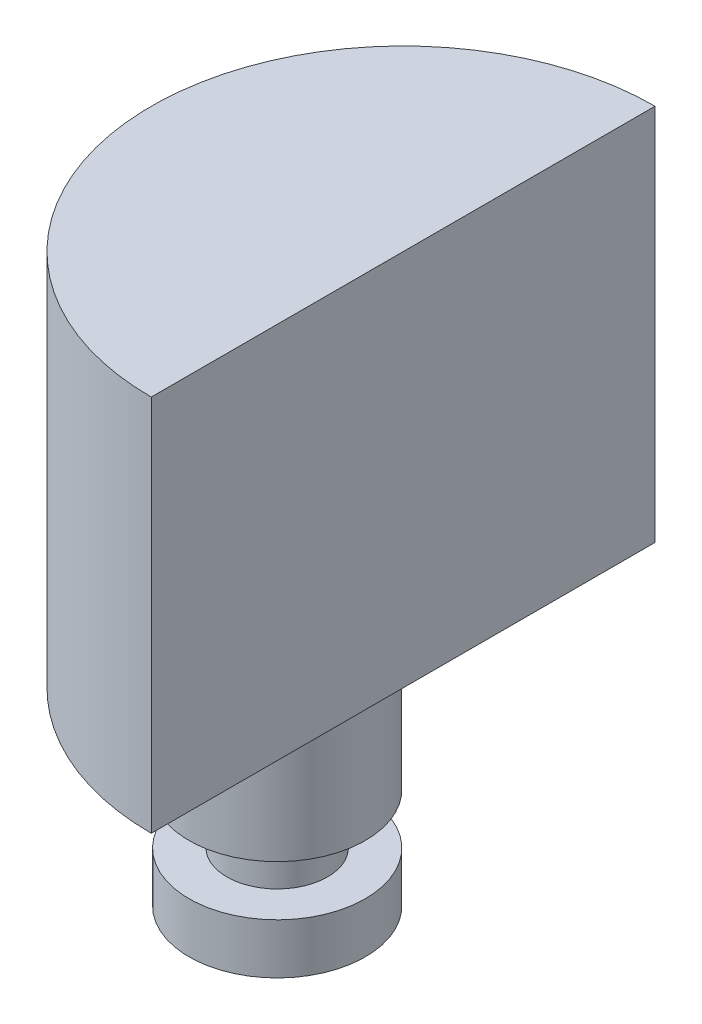
ISO-10303-21;
HEADER;
FILE_DESCRIPTION(('STEP AP214'),'2;1');
FILE_NAME('part.step','',(''),(''),'','','');
FILE_SCHEMA(('AUTOMOTIVE_DESIGN { 1 0 10303 214 1 1 1 1 }'));
ENDSEC;
DATA;
#1=APPLICATION_CONTEXT('core data for automotive mechanical design processes');
#2=APPLICATION_PROTOCOL_DEFINITION('international standard','automotive_design',2000,#1);
#3=PRODUCT_CONTEXT('',#1,'mechanical');
#4=PRODUCT('Part','Part','',(#3));
#5=PRODUCT_RELATED_PRODUCT_CATEGORY('part','',(#4));
#6=PRODUCT_DEFINITION_FORMATION('','',#4);
#7=PRODUCT_DEFINITION_CONTEXT('part definition',#1,'design');
#8=PRODUCT_DEFINITION('design','',#6,#7);
#9=PRODUCT_DEFINITION_SHAPE('','',#8);
#10=(LENGTH_UNIT() NAMED_UNIT(*) SI_UNIT(.MILLI.,.METRE.));
#11=(NAMED_UNIT(*) PLANE_ANGLE_UNIT() SI_UNIT($,.RADIAN.));
#12=(NAMED_UNIT(*) SI_UNIT($,.STERADIAN.) SOLID_ANGLE_UNIT());
#13=UNCERTAINTY_MEASURE_WITH_UNIT(LENGTH_MEASURE(1.E-05),#10,'distance_accuracy_value','');
#14=(GEOMETRIC_REPRESENTATION_CONTEXT(3) GLOBAL_UNCERTAINTY_ASSIGNED_CONTEXT((#13)) GLOBAL_UNIT_ASSIGNED_CONTEXT((#10,
#11,#12)) REPRESENTATION_CONTEXT('',''));
#15=CARTESIAN_POINT('',(0.,0.,0.));
#16=DIRECTION('',(0.,0.,1.));
#17=DIRECTION('',(1.,0.,0.));
#18=AXIS2_PLACEMENT_3D('',#15,#16,#17);
#19=CARTESIAN_POINT('',(0.,15.,0.));
#20=DIRECTION('',(0.,-1.,0.));
#21=DIRECTION('',(0.,0.,-1.));
#22=AXIS2_PLACEMENT_3D('',#19,#20,#21);
#23=CYLINDRICAL_SURFACE('',#22,10.);
#24=CARTESIAN_POINT('',(0.,0.,0.));
#25=DIRECTION('',(0.,1.,0.));
#26=DIRECTION('',(0.,0.,1.));
#27=AXIS2_PLACEMENT_3D('',#24,#25,#26);
#28=CIRCLE('',#27,10.);
#29=CARTESIAN_POINT('',(0.,0.,-10.));
#30=VERTEX_POINT('',#29);
#31=CARTESIAN_POINT('',(0.,0.,10.));
#32=VERTEX_POINT('',#31);
#33=EDGE_CURVE('E80',#30,#32,#28,.T.);
#34=ORIENTED_EDGE('',*,*,#33,.T.);
#35=DIRECTION('',(0.,-1.,0.));
#36=VECTOR('',#35,1.);
#37=CARTESIAN_POINT('',(0.,15.,10.));
#38=LINE('',#37,#36);
#39=CARTESIAN_POINT('',(0.,15.,10.));
#40=VERTEX_POINT('',#39);
#41=EDGE_CURVE('E46',#40,#32,#38,.T.);
#42=ORIENTED_EDGE('',*,*,#41,.F.);
#43=CARTESIAN_POINT('',(0.,15.,0.));
#44=DIRECTION('',(0.,1.,0.));
#45=DIRECTION('',(0.,0.,1.));
#46=AXIS2_PLACEMENT_3D('',#43,#44,#45);
#47=CIRCLE('',#46,10.);
#48=CARTESIAN_POINT('',(0.,15.,-10.));
#49=VERTEX_POINT('',#48);
#50=EDGE_CURVE('E79',#49,#40,#47,.T.);
#51=ORIENTED_EDGE('',*,*,#50,.F.);
#52=DIRECTION('',(0.,-1.,0.));
#53=VECTOR('',#52,1.);
#54=CARTESIAN_POINT('',(0.,15.,-10.));
#55=LINE('',#54,#53);
#56=EDGE_CURVE('E74',#49,#30,#55,.T.);
#57=ORIENTED_EDGE('',*,*,#56,.T.);
#58=EDGE_LOOP('',(#34,#42,#51,#57));
#59=FACE_BOUND('',#58,.T.);
#60=ADVANCED_FACE('F43',(#59),#23,.T.);
#61=CARTESIAN_POINT('',(0.,15.,-10.));
#62=DIRECTION('',(-1.,0.,0.));
#63=DIRECTION('',(0.,0.,1.));
#64=AXIS2_PLACEMENT_3D('',#61,#62,#63);
#65=PLANE('',#64);
#66=DIRECTION('',(0.,0.,-1.));
#67=VECTOR('',#66,1.);
#68=CARTESIAN_POINT('',(0.,0.,-10.));
#69=LINE('',#68,#67);
#70=EDGE_CURVE('E69',#32,#30,#69,.T.);
#71=ORIENTED_EDGE('',*,*,#70,.T.);
#72=ORIENTED_EDGE('',*,*,#56,.F.);
#73=DIRECTION('',(0.,0.,-1.));
#74=VECTOR('',#73,1.);
#75=CARTESIAN_POINT('',(0.,15.,-10.));
#76=LINE('',#75,#74);
#77=EDGE_CURVE('E61',#40,#49,#76,.T.);
#78=ORIENTED_EDGE('',*,*,#77,.F.);
#79=ORIENTED_EDGE('',*,*,#41,.T.);
#80=EDGE_LOOP('',(#71,#72,#78,#79));
#81=FACE_BOUND('',#80,.T.);
#82=ADVANCED_FACE('F73',(#81),#65,.F.);
#83=CARTESIAN_POINT('',(0.,15.,0.));
#84=DIRECTION('',(0.,1.,0.));
#85=DIRECTION('',(0.,0.,1.));
#86=AXIS2_PLACEMENT_3D('',#83,#84,#85);
#87=PLANE('',#86);
#88=ORIENTED_EDGE('',*,*,#50,.T.);
#89=ORIENTED_EDGE('',*,*,#77,.T.);
#90=EDGE_LOOP('',(#88,#89));
#91=FACE_BOUND('',#90,.T.);
#92=ADVANCED_FACE('F133',(#91),#87,.T.);
#93=CARTESIAN_POINT('',(0.,0.,0.));
#94=DIRECTION('',(0.,1.,0.));
#95=DIRECTION('',(0.,0.,1.));
#96=AXIS2_PLACEMENT_3D('',#93,#94,#95);
#97=PLANE('',#96);
#98=CARTESIAN_POINT('',(-5.,0.,0.));
#99=DIRECTION('',(0.,-1.,0.));
#100=DIRECTION('',(0.,0.,-1.));
#101=AXIS2_PLACEMENT_3D('',#98,#99,#100);
#102=CIRCLE('',#101,3.5);
#103=CARTESIAN_POINT('',(-5.,0.,-3.5));
#104=VERTEX_POINT('',#103);
#105=EDGE_CURVE('E53',#104,#104,#102,.T.);
#106=ORIENTED_EDGE('',*,*,#105,.F.);
#107=EDGE_LOOP('',(#106));
#108=FACE_BOUND('',#107,.T.);
#109=ORIENTED_EDGE('',*,*,#33,.F.);
#110=ORIENTED_EDGE('',*,*,#70,.F.);
#111=EDGE_LOOP('',(#109,#110));
#112=FACE_BOUND('',#111,.T.);
#113=ADVANCED_FACE('F84',(#108,#112),#97,.F.);
#114=CARTESIAN_POINT('',(-5.,-6.,0.));
#115=DIRECTION('',(0.,1.,0.));
#116=DIRECTION('',(0.,0.,1.));
#117=AXIS2_PLACEMENT_3D('',#114,#115,#116);
#118=CYLINDRICAL_SURFACE('',#117,3.5);
#119=CARTESIAN_POINT('',(-5.,-6.,0.));
#120=DIRECTION('',(0.,-1.,0.));
#121=DIRECTION('',(0.,0.,-1.));
#122=AXIS2_PLACEMENT_3D('',#119,#120,#121);
#123=CIRCLE('',#122,3.5);
#124=CARTESIAN_POINT('',(-5.,-6.,-3.5));
#125=VERTEX_POINT('',#124);
#126=EDGE_CURVE('E86',#125,#125,#123,.T.);
#127=ORIENTED_EDGE('',*,*,#126,.F.);
#128=EDGE_LOOP('',(#127));
#129=FACE_BOUND('',#128,.T.);
#130=ORIENTED_EDGE('',*,*,#105,.T.);
#131=EDGE_LOOP('',(#130));
#132=FACE_BOUND('',#131,.T.);
#133=ADVANCED_FACE('F140',(#129,#132),#118,.T.);
#134=CARTESIAN_POINT('',(-5.,-6.,0.));
#135=DIRECTION('',(0.,-1.,0.));
#136=DIRECTION('',(0.,0.,-1.));
#137=AXIS2_PLACEMENT_3D('',#134,#135,#136);
#138=PLANE('',#137);
#139=CARTESIAN_POINT('',(-5.,-6.,0.));
#140=DIRECTION('',(0.,-1.,0.));
#141=DIRECTION('',(0.,0.,-1.));
#142=AXIS2_PLACEMENT_3D('',#139,#140,#141);
#143=CIRCLE('',#142,2.);
#144=CARTESIAN_POINT('',(-5.,-6.,-2.));
#145=VERTEX_POINT('',#144);
#146=EDGE_CURVE('E11',#145,#145,#143,.T.);
#147=ORIENTED_EDGE('',*,*,#146,.F.);
#148=EDGE_LOOP('',(#147));
#149=FACE_BOUND('',#148,.T.);
#150=ORIENTED_EDGE('',*,*,#126,.T.);
#151=EDGE_LOOP('',(#150));
#152=FACE_BOUND('',#151,.T.);
#153=ADVANCED_FACE('F145',(#149,#152),#138,.T.);
#154=CARTESIAN_POINT('',(-5.,-8.,0.));
#155=DIRECTION('',(0.,1.,0.));
#156=DIRECTION('',(0.,0.,1.));
#157=AXIS2_PLACEMENT_3D('',#154,#155,#156);
#158=CYLINDRICAL_SURFACE('',#157,2.);
#159=CARTESIAN_POINT('',(-5.,-8.,0.));
#160=DIRECTION('',(0.,-1.,0.));
#161=DIRECTION('',(0.,0.,-1.));
#162=AXIS2_PLACEMENT_3D('',#159,#160,#161);
#163=CIRCLE('',#162,2.);
#164=CARTESIAN_POINT('',(-5.,-8.,-2.));
#165=VERTEX_POINT('',#164);
#166=EDGE_CURVE('E90',#165,#165,#163,.T.);
#167=ORIENTED_EDGE('',*,*,#166,.F.);
#168=EDGE_LOOP('',(#167));
#169=FACE_BOUND('',#168,.T.);
#170=ORIENTED_EDGE('',*,*,#146,.T.);
#171=EDGE_LOOP('',(#170));
#172=FACE_BOUND('',#171,.T.);
#173=ADVANCED_FACE('F117',(#169,#172),#158,.T.);
#174=CARTESIAN_POINT('',(-5.,-10.,0.));
#175=DIRECTION('',(0.,1.,0.));
#176=DIRECTION('',(0.,0.,1.));
#177=AXIS2_PLACEMENT_3D('',#174,#175,#176);
#178=CYLINDRICAL_SURFACE('',#177,3.5);
#179=CARTESIAN_POINT('',(-5.,-10.,0.));
#180=DIRECTION('',(0.,-1.,0.));
#181=DIRECTION('',(0.,0.,-1.));
#182=AXIS2_PLACEMENT_3D('',#179,#180,#181);
#183=CIRCLE('',#182,3.5);
#184=CARTESIAN_POINT('',(-5.,-10.,-3.5));
#185=VERTEX_POINT('',#184);
#186=EDGE_CURVE('E103',#185,#185,#183,.T.);
#187=ORIENTED_EDGE('',*,*,#186,.F.);
#188=EDGE_LOOP('',(#187));
#189=FACE_BOUND('',#188,.T.);
#190=CARTESIAN_POINT('',(-5.,-8.,0.));
#191=DIRECTION('',(0.,-1.,0.));
#192=DIRECTION('',(0.,0.,-1.));
#193=AXIS2_PLACEMENT_3D('',#190,#191,#192);
#194=CIRCLE('',#193,3.5);
#195=CARTESIAN_POINT('',(-5.,-8.,-3.5));
#196=VERTEX_POINT('',#195);
#197=EDGE_CURVE('E104',#196,#196,#194,.T.);
#198=ORIENTED_EDGE('',*,*,#197,.T.);
#199=EDGE_LOOP('',(#198));
#200=FACE_BOUND('',#199,.T.);
#201=ADVANCED_FACE('F114',(#189,#200),#178,.T.);
#202=CARTESIAN_POINT('',(-5.,-10.,0.));
#203=DIRECTION('',(0.,-1.,0.));
#204=DIRECTION('',(0.,0.,-1.));
#205=AXIS2_PLACEMENT_3D('',#202,#203,#204);
#206=PLANE('',#205);
#207=ORIENTED_EDGE('',*,*,#186,.T.);
#208=EDGE_LOOP('',(#207));
#209=FACE_BOUND('',#208,.T.);
#210=ADVANCED_FACE('F112',(#209),#206,.T.);
#211=CARTESIAN_POINT('',(-5.,-8.,0.));
#212=DIRECTION('',(0.,-1.,0.));
#213=DIRECTION('',(0.,0.,-1.));
#214=AXIS2_PLACEMENT_3D('',#211,#212,#213);
#215=PLANE('',#214);
#216=ORIENTED_EDGE('',*,*,#166,.T.);
#217=EDGE_LOOP('',(#216));
#218=FACE_BOUND('',#217,.T.);
#219=ORIENTED_EDGE('',*,*,#197,.F.);
#220=EDGE_LOOP('',(#219));
#221=FACE_BOUND('',#220,.T.);
#222=ADVANCED_FACE('F121',(#218,#221),#215,.F.);
#223=CLOSED_SHELL('',(#60,#82,#92,#113,#133,#153,#173,#201,#210,#222));
#224=MANIFOLD_SOLID_BREP('B2',#223);
#225=ADVANCED_BREP_SHAPE_REPRESENTATION('',(#18,#224),#14);
#226=SHAPE_DEFINITION_REPRESENTATION(#9,#225);
ENDSEC;
END-ISO-10303-21;
